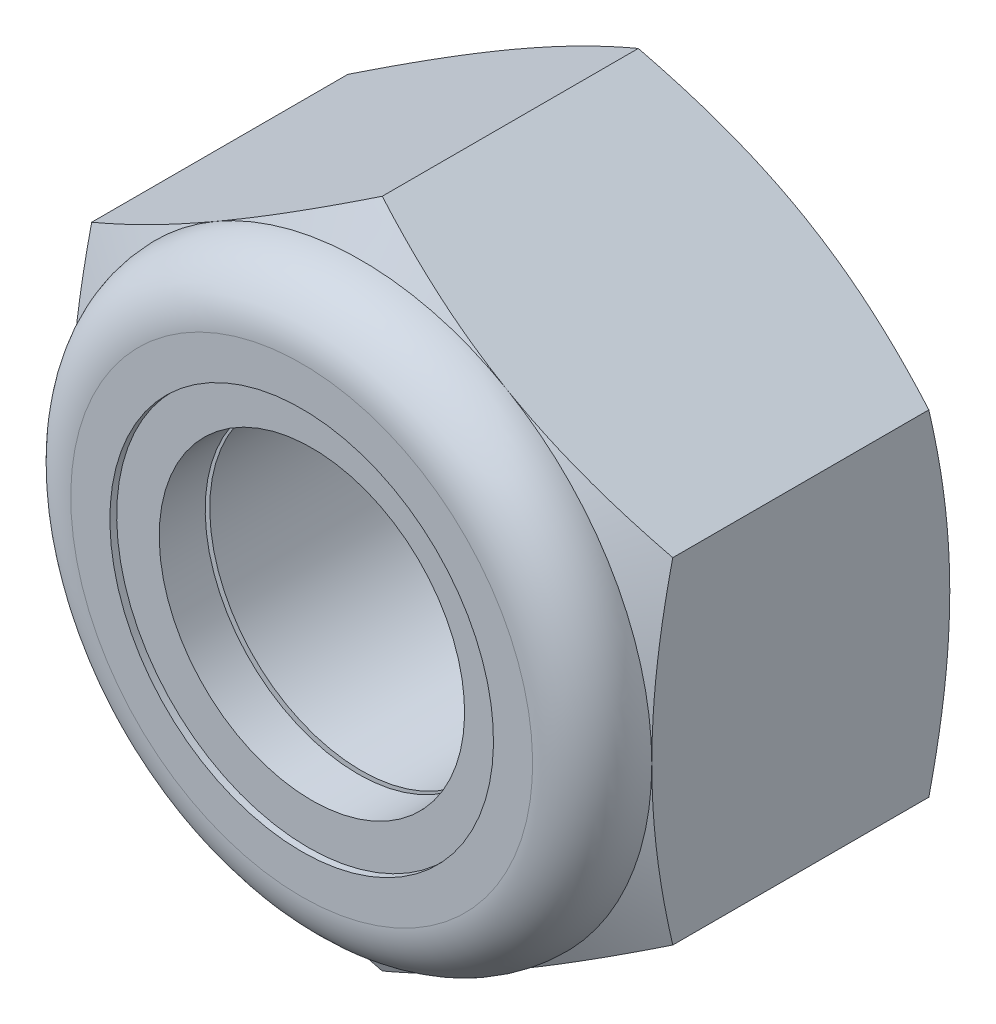
ISO-10303-21;
HEADER;
FILE_DESCRIPTION(('STEP AP214'),'2;1');
FILE_NAME('part.step','',(''),(''),'','','');
FILE_SCHEMA(('AUTOMOTIVE_DESIGN { 1 0 10303 214 1 1 1 1 }'));
ENDSEC;
DATA;
#1=APPLICATION_CONTEXT('core data for automotive mechanical design processes');
#2=APPLICATION_PROTOCOL_DEFINITION('international standard','automotive_design',2000,#1);
#3=PRODUCT_CONTEXT('',#1,'mechanical');
#4=PRODUCT('Part','Part','',(#3));
#5=PRODUCT_RELATED_PRODUCT_CATEGORY('part','',(#4));
#6=PRODUCT_DEFINITION_FORMATION('','',#4);
#7=PRODUCT_DEFINITION_CONTEXT('part definition',#1,'design');
#8=PRODUCT_DEFINITION('design','',#6,#7);
#9=PRODUCT_DEFINITION_SHAPE('','',#8);
#10=(LENGTH_UNIT() NAMED_UNIT(*) SI_UNIT(.MILLI.,.METRE.));
#11=(NAMED_UNIT(*) PLANE_ANGLE_UNIT() SI_UNIT($,.RADIAN.));
#12=(NAMED_UNIT(*) SI_UNIT($,.STERADIAN.) SOLID_ANGLE_UNIT());
#13=UNCERTAINTY_MEASURE_WITH_UNIT(LENGTH_MEASURE(1.E-05),#10,'distance_accuracy_value','');
#14=(GEOMETRIC_REPRESENTATION_CONTEXT(3) GLOBAL_UNCERTAINTY_ASSIGNED_CONTEXT((#13)) GLOBAL_UNIT_ASSIGNED_CONTEXT((#10,
#11,#12)) REPRESENTATION_CONTEXT('',''));
#15=CARTESIAN_POINT('',(0.,0.,0.));
#16=DIRECTION('',(0.,0.,1.));
#17=DIRECTION('',(1.,0.,0.));
#18=AXIS2_PLACEMENT_3D('',#15,#16,#17);
#19=CARTESIAN_POINT('',(0.,5.16666666666666,7.8476));
#20=DIRECTION('',(0.,0.,1.));
#21=DIRECTION('',(0.,-1.,0.));
#22=AXIS2_PLACEMENT_3D('',#19,#20,#21);
#23=PLANE('',#22);
#24=CARTESIAN_POINT('',(0.,0.,7.8476));
#25=DIRECTION('',(0.,0.,-1.));
#26=DIRECTION('',(0.,1.,0.));
#27=AXIS2_PLACEMENT_3D('',#24,#25,#26);
#28=CIRCLE('',#27,4.29131001134832);
#29=CARTESIAN_POINT('',(0.,-4.29131001134832,7.8476));
#30=VERTEX_POINT('',#29);
#31=EDGE_CURVE('P0_E226',#30,#30,#28,.T.);
#32=ORIENTED_EDGE('',*,*,#31,.F.);
#33=EDGE_LOOP('',(#32));
#34=FACE_BOUND('',#33,.T.);
#35=CARTESIAN_POINT('',(0.,0.,7.8476));
#36=DIRECTION('',(0.,0.,-1.));
#37=DIRECTION('',(0.,1.,0.));
#38=AXIS2_PLACEMENT_3D('',#35,#36,#37);
#39=CIRCLE('',#38,5.16666666666667);
#40=CARTESIAN_POINT('',(0.,-5.16666666666667,7.8476));
#41=VERTEX_POINT('',#40);
#42=EDGE_CURVE('P0_E204',#41,#41,#39,.T.);
#43=ORIENTED_EDGE('',*,*,#42,.T.);
#44=EDGE_LOOP('',(#43));
#45=FACE_BOUND('',#44,.T.);
#46=ADVANCED_FACE('P0_F17',(#34,#45),#23,.F.);
#47=CARTESIAN_POINT('',(0.,0.,6.66666666666667));
#48=DIRECTION('',(0.,0.,-1.));
#49=DIRECTION('',(-1.,0.,0.));
#50=AXIS2_PLACEMENT_3D('',#47,#48,#49);
#51=PLANE('',#50);
#52=CARTESIAN_POINT('',(0.,0.,6.66666666666667));
#53=DIRECTION('',(0.,0.,1.));
#54=DIRECTION('',(0.,1.,0.));
#55=AXIS2_PLACEMENT_3D('',#52,#53,#54);
#56=CIRCLE('',#55,3.38975);
#57=CARTESIAN_POINT('',(0.,-3.38975,6.66666666666667));
#58=VERTEX_POINT('',#57);
#59=EDGE_CURVE('P0_E404',#58,#58,#56,.T.);
#60=ORIENTED_EDGE('',*,*,#59,.F.);
#61=EDGE_LOOP('',(#60));
#62=FACE_BOUND('',#61,.T.);
#63=CARTESIAN_POINT('',(0.,0.,6.66666666666667));
#64=DIRECTION('',(0.,0.,-1.));
#65=DIRECTION('',(0.,1.,0.));
#66=AXIS2_PLACEMENT_3D('',#63,#64,#65);
#67=CIRCLE('',#66,6.3476);
#68=CARTESIAN_POINT('',(0.,-6.3476,6.66666666666666));
#69=VERTEX_POINT('',#68);
#70=EDGE_CURVE('P0_E123',#69,#69,#67,.T.);
#71=ORIENTED_EDGE('',*,*,#70,.F.);
#72=EDGE_LOOP('',(#71));
#73=FACE_BOUND('',#72,.T.);
#74=ADVANCED_FACE('P0_F551',(#62,#73),#51,.F.);
#75=CARTESIAN_POINT('',(6.5,3.75277674973257,8.));
#76=DIRECTION('',(-0.5,-0.866025403784439,0.));
#77=DIRECTION('',(-0.866025403784439,0.5,0.));
#78=AXIS2_PLACEMENT_3D('',#75,#76,#77);
#79=PLANE('',#78);
#80=DIRECTION('',(0.,0.,-1.));
#81=VECTOR('',#80,1.);
#82=CARTESIAN_POINT('',(0.,7.50555349946514,8.));
#83=LINE('',#82,#81);
#84=CARTESIAN_POINT('',(0.,7.50555349946514,6.19776936918152));
#85=VERTEX_POINT('',#84);
#86=CARTESIAN_POINT('',(0.,7.50555349946514,0.468897297485159));
#87=VERTEX_POINT('',#86);
#88=EDGE_CURVE('P0_E11',#85,#87,#83,.T.);
#89=ORIENTED_EDGE('',*,*,#88,.F.);
#90=CARTESIAN_POINT('',(-8.11402595225573E-12,7.50555349946982,6.19776936917933));
#91=CARTESIAN_POINT('',(1.74166975079905,6.50000000000188,6.66666666666667));
#92=CARTESIAN_POINT('',(3.25000000000002,5.62916512459884,6.66666666666667));
#93=(BOUNDED_CURVE() B_SPLINE_CURVE(2,(#90,#91,#92),.UNSPECIFIED.,.F.,
.F.) B_SPLINE_CURVE_WITH_KNOTS((3,3),(1.49446607017309,2.3298655330262),
.UNSPECIFIED.) CURVE() GEOMETRIC_REPRESENTATION_ITEM() RATIONAL_B_SPLINE_CURVE((2.10211040392093,
2.26470920953128,2.26470920953128)) REPRESENTATION_ITEM(''));
#94=CARTESIAN_POINT('',(3.25,5.62916512459885,6.66666666666667));
#95=VERTEX_POINT('',#94);
#96=EDGE_CURVE('P0_E304',#85,#95,#93,.T.);
#97=ORIENTED_EDGE('',*,*,#96,.T.);
#98=CARTESIAN_POINT('',(3.25,5.62916512459884,6.66666666666667));
#99=CARTESIAN_POINT('',(4.75833024920097,4.75833024919582,6.66666666666667));
#100=CARTESIAN_POINT('',(6.50000000000809,3.75277674972789,6.19776936917933));
#101=(BOUNDED_CURVE() B_SPLINE_CURVE(2,(#98,#99,#100),.UNSPECIFIED.,.F.,
.F.) B_SPLINE_CURVE_WITH_KNOTS((3,3),(2.32986553302619,3.16526499587929),
.UNSPECIFIED.) CURVE() GEOMETRIC_REPRESENTATION_ITEM() RATIONAL_B_SPLINE_CURVE((2.26470920953128,
2.26470920953128,2.10211040392093)) REPRESENTATION_ITEM(''));
#102=CARTESIAN_POINT('',(6.5,3.75277674973258,6.19776936918152));
#103=VERTEX_POINT('',#102);
#104=EDGE_CURVE('P0_E232',#95,#103,#101,.T.);
#105=ORIENTED_EDGE('',*,*,#104,.T.);
#106=DIRECTION('',(0.,0.,-1.));
#107=VECTOR('',#106,1.);
#108=CARTESIAN_POINT('',(6.5,3.75277674973257,8.));
#109=LINE('',#108,#107);
#110=CARTESIAN_POINT('',(6.5,3.75277674973258,0.468897297485154));
#111=VERTEX_POINT('',#110);
#112=EDGE_CURVE('P0_E162',#103,#111,#109,.T.);
#113=ORIENTED_EDGE('',*,*,#112,.T.);
#114=CARTESIAN_POINT('',(6.5000000000081,3.75277674972789,0.468897297487336));
#115=CARTESIAN_POINT('',(4.75833024920096,4.75833024919583,0.));
#116=CARTESIAN_POINT('',(3.25,5.62916512459886,0.));
#117=(BOUNDED_CURVE() B_SPLINE_CURVE(2,(#114,#115,#116),.UNSPECIFIED.,.F.,
.F.) B_SPLINE_CURVE_WITH_KNOTS((3,3),(1.49446607017308,2.32986553302618),
.UNSPECIFIED.) CURVE() GEOMETRIC_REPRESENTATION_ITEM() RATIONAL_B_SPLINE_CURVE((2.10211040392092,
2.26470920953127,2.26470920953127)) REPRESENTATION_ITEM(''));
#118=CARTESIAN_POINT('',(3.25,5.62916512459885,0.));
#119=VERTEX_POINT('',#118);
#120=EDGE_CURVE('P0_E243',#111,#119,#117,.T.);
#121=ORIENTED_EDGE('',*,*,#120,.T.);
#122=CARTESIAN_POINT('',(3.25,5.62916512459886,0.));
#123=CARTESIAN_POINT('',(1.74166975079904,6.50000000000189,0.));
#124=CARTESIAN_POINT('',(-8.11127958854562E-12,7.50555349946983,0.468897297487341));
#125=(BOUNDED_CURVE() B_SPLINE_CURVE(2,(#122,#123,#124),.UNSPECIFIED.,.F.,
.F.) B_SPLINE_CURVE_WITH_KNOTS((3,3),(2.32986553302618,3.16526499587928),
.UNSPECIFIED.) CURVE() GEOMETRIC_REPRESENTATION_ITEM() RATIONAL_B_SPLINE_CURVE((2.26470920953127,
2.26470920953127,2.10211040392092)) REPRESENTATION_ITEM(''));
#126=EDGE_CURVE('P0_E242',#119,#87,#125,.T.);
#127=ORIENTED_EDGE('',*,*,#126,.T.);
#128=EDGE_LOOP('',(#89,#97,#105,#113,#121,#127));
#129=FACE_BOUND('',#128,.T.);
#130=ADVANCED_FACE('P0_F557',(#129),#79,.F.);
#131=CARTESIAN_POINT('',(0.,7.50555349946514,8.));
#132=DIRECTION('',(0.5,-0.866025403784439,0.));
#133=DIRECTION('',(0.,0.,-1.));
#134=AXIS2_PLACEMENT_3D('',#131,#132,#133);
#135=PLANE('',#134);
#136=DIRECTION('',(0.,0.,-1.));
#137=VECTOR('',#136,1.);
#138=CARTESIAN_POINT('',(-6.5,3.75277674973257,8.));
#139=LINE('',#138,#137);
#140=CARTESIAN_POINT('',(-6.5,3.75277674973257,6.19776936918152));
#141=VERTEX_POINT('',#140);
#142=CARTESIAN_POINT('',(-6.5,3.75277674973258,0.468897297485157));
#143=VERTEX_POINT('',#142);
#144=EDGE_CURVE('P0_E30',#141,#143,#139,.T.);
#145=ORIENTED_EDGE('',*,*,#144,.F.);
#146=CARTESIAN_POINT('',(-6.50000000000811,3.75277674972789,6.19776936917933));
#147=CARTESIAN_POINT('',(-4.75833024920097,4.75833024919582,6.66666666666667));
#148=CARTESIAN_POINT('',(-3.25,5.62916512459886,6.66666666666667));
#149=(BOUNDED_CURVE() B_SPLINE_CURVE(2,(#146,#147,#148),.UNSPECIFIED.,.F.,
.F.) B_SPLINE_CURVE_WITH_KNOTS((3,3),(1.49446607017309,2.3298655330262),
.UNSPECIFIED.) CURVE() GEOMETRIC_REPRESENTATION_ITEM() RATIONAL_B_SPLINE_CURVE((2.10211040392093,
2.26470920953128,2.26470920953128)) REPRESENTATION_ITEM(''));
#150=CARTESIAN_POINT('',(-3.25,5.62916512459886,6.66666666666667));
#151=VERTEX_POINT('',#150);
#152=EDGE_CURVE('P0_E108',#141,#151,#149,.T.);
#153=ORIENTED_EDGE('',*,*,#152,.T.);
#154=CARTESIAN_POINT('',(-3.25,5.62916512459886,6.66666666666667));
#155=CARTESIAN_POINT('',(-1.74166975079904,6.50000000000188,6.66666666666667));
#156=CARTESIAN_POINT('',(8.10135042743967E-12,7.50555349946982,6.19776936917933));
#157=(BOUNDED_CURVE() B_SPLINE_CURVE(2,(#154,#155,#156),.UNSPECIFIED.,.F.,
.F.) B_SPLINE_CURVE_WITH_KNOTS((3,3),(2.3298655330262,3.16526499587929),
.UNSPECIFIED.) CURVE() GEOMETRIC_REPRESENTATION_ITEM() RATIONAL_B_SPLINE_CURVE((2.26470920953128,
2.26470920953128,2.10211040392093)) REPRESENTATION_ITEM(''));
#158=EDGE_CURVE('P0_E310',#151,#85,#157,.T.);
#159=ORIENTED_EDGE('',*,*,#158,.T.);
#160=ORIENTED_EDGE('',*,*,#88,.T.);
#161=CARTESIAN_POINT('',(8.10890292764262E-12,7.50555349946983,0.468897297487343));
#162=CARTESIAN_POINT('',(-1.74166975079904,6.50000000000189,0.));
#163=CARTESIAN_POINT('',(-3.25,5.62916512459886,0.));
#164=(BOUNDED_CURVE() B_SPLINE_CURVE(2,(#161,#162,#163),.UNSPECIFIED.,.F.,
.F.) B_SPLINE_CURVE_WITH_KNOTS((3,3),(1.49446607017308,2.32986553302618),
.UNSPECIFIED.) CURVE() GEOMETRIC_REPRESENTATION_ITEM() RATIONAL_B_SPLINE_CURVE((2.10211040392092,
2.26470920953127,2.26470920953127)) REPRESENTATION_ITEM(''));
#165=CARTESIAN_POINT('',(-3.25,5.62916512459885,0.));
#166=VERTEX_POINT('',#165);
#167=EDGE_CURVE('P0_E233',#87,#166,#164,.T.);
#168=ORIENTED_EDGE('',*,*,#167,.T.);
#169=CARTESIAN_POINT('',(-3.25,5.62916512459886,0.));
#170=CARTESIAN_POINT('',(-4.75833024920096,4.75833024919583,0.));
#171=CARTESIAN_POINT('',(-6.50000000000811,3.75277674972789,0.46889729748734));
#172=(BOUNDED_CURVE() B_SPLINE_CURVE(2,(#169,#170,#171),.UNSPECIFIED.,.F.,
.F.) B_SPLINE_CURVE_WITH_KNOTS((3,3),(2.32986553302618,3.16526499587928),
.UNSPECIFIED.) CURVE() GEOMETRIC_REPRESENTATION_ITEM() RATIONAL_B_SPLINE_CURVE((2.26470920953127,
2.26470920953127,2.10211040392092)) REPRESENTATION_ITEM(''));
#173=EDGE_CURVE('P0_E205',#166,#143,#172,.T.);
#174=ORIENTED_EDGE('',*,*,#173,.T.);
#175=EDGE_LOOP('',(#145,#153,#159,#160,#168,#174));
#176=FACE_BOUND('',#175,.T.);
#177=ADVANCED_FACE('P0_F581',(#176),#135,.F.);
#178=CARTESIAN_POINT('',(-6.5,3.75277674973257,8.));
#179=DIRECTION('',(1.,0.,0.));
#180=DIRECTION('',(0.,1.,0.));
#181=AXIS2_PLACEMENT_3D('',#178,#179,#180);
#182=PLANE('',#181);
#183=DIRECTION('',(0.,0.,-1.));
#184=VECTOR('',#183,1.);
#185=CARTESIAN_POINT('',(-6.5,-3.75277674973257,8.));
#186=LINE('',#185,#184);
#187=CARTESIAN_POINT('',(-6.5,-3.75277674973257,6.19776936918151));
#188=VERTEX_POINT('',#187);
#189=CARTESIAN_POINT('',(-6.5,-3.75277674973256,0.468897297485152));
#190=VERTEX_POINT('',#189);
#191=EDGE_CURVE('P0_E292',#188,#190,#186,.T.);
#192=ORIENTED_EDGE('',*,*,#191,.F.);
#193=CARTESIAN_POINT('',(-6.5,-3.75277674974193,6.19776936917933));
#194=CARTESIAN_POINT('',(-6.5,-1.74166975080606,6.66666666666667));
#195=CARTESIAN_POINT('',(-6.5,0.,6.66666666666667));
#196=(BOUNDED_CURVE() B_SPLINE_CURVE(2,(#193,#194,#195),.UNSPECIFIED.,.F.,
.F.) B_SPLINE_CURVE_WITH_KNOTS((3,3),(1.49446607017309,2.3298655330262),
.UNSPECIFIED.) CURVE() GEOMETRIC_REPRESENTATION_ITEM() RATIONAL_B_SPLINE_CURVE((2.10211040392093,
2.26470920953128,2.26470920953128)) REPRESENTATION_ITEM(''));
#197=CARTESIAN_POINT('',(-6.5,0.,6.66666666666667));
#198=VERTEX_POINT('',#197);
#199=EDGE_CURVE('P0_E390',#188,#198,#196,.T.);
#200=ORIENTED_EDGE('',*,*,#199,.T.);
#201=CARTESIAN_POINT('',(-6.5,0.,6.66666666666667));
#202=CARTESIAN_POINT('',(-6.5,1.74166975080607,6.66666666666667));
#203=CARTESIAN_POINT('',(-6.50000000000001,3.75277674974195,6.19776936917933));
#204=(BOUNDED_CURVE() B_SPLINE_CURVE(2,(#201,#202,#203),.UNSPECIFIED.,.F.,
.F.) B_SPLINE_CURVE_WITH_KNOTS((3,3),(2.3298655330262,3.1652649958793),
.UNSPECIFIED.) CURVE() GEOMETRIC_REPRESENTATION_ITEM() RATIONAL_B_SPLINE_CURVE((2.26470920953128,
2.26470920953128,2.10211040392093)) REPRESENTATION_ITEM(''));
#205=EDGE_CURVE('P0_E173',#198,#141,#204,.T.);
#206=ORIENTED_EDGE('',*,*,#205,.T.);
#207=ORIENTED_EDGE('',*,*,#144,.T.);
#208=CARTESIAN_POINT('',(-6.5,3.75277674974194,0.46889729748734));
#209=CARTESIAN_POINT('',(-6.5,1.74166975080607,0.));
#210=CARTESIAN_POINT('',(-6.5,0.,0.));
#211=(BOUNDED_CURVE() B_SPLINE_CURVE(2,(#208,#209,#210),.UNSPECIFIED.,.F.,
.F.) B_SPLINE_CURVE_WITH_KNOTS((3,3),(1.49446607017308,2.32986553302618),
.UNSPECIFIED.) CURVE() GEOMETRIC_REPRESENTATION_ITEM() RATIONAL_B_SPLINE_CURVE((2.10211040392092,
2.26470920953127,2.26470920953127)) REPRESENTATION_ITEM(''));
#212=CARTESIAN_POINT('',(-6.5,0.,0.));
#213=VERTEX_POINT('',#212);
#214=EDGE_CURVE('P0_E212',#143,#213,#211,.T.);
#215=ORIENTED_EDGE('',*,*,#214,.T.);
#216=CARTESIAN_POINT('',(-6.5,0.,0.));
#217=CARTESIAN_POINT('',(-6.5,-1.74166975080605,0.));
#218=CARTESIAN_POINT('',(-6.5,-3.75277674974192,0.468897297487329));
#219=(BOUNDED_CURVE() B_SPLINE_CURVE(2,(#216,#217,#218),.UNSPECIFIED.,.F.,
.F.) B_SPLINE_CURVE_WITH_KNOTS((3,3),(2.32986553302618,3.16526499587927),
.UNSPECIFIED.) CURVE() GEOMETRIC_REPRESENTATION_ITEM() RATIONAL_B_SPLINE_CURVE((2.26470920953127,
2.26470920953127,2.10211040392092)) REPRESENTATION_ITEM(''));
#220=EDGE_CURVE('P0_E345',#213,#190,#219,.T.);
#221=ORIENTED_EDGE('',*,*,#220,.T.);
#222=EDGE_LOOP('',(#192,#200,#206,#207,#215,#221));
#223=FACE_BOUND('',#222,.T.);
#224=ADVANCED_FACE('P0_F527',(#223),#182,.F.);
#225=CARTESIAN_POINT('',(-6.5,-3.75277674973257,8.));
#226=DIRECTION('',(0.5,0.866025403784439,0.));
#227=DIRECTION('',(0.,0.,-1.));
#228=AXIS2_PLACEMENT_3D('',#225,#226,#227);
#229=PLANE('',#228);
#230=DIRECTION('',(0.,0.,-1.));
#231=VECTOR('',#230,1.);
#232=CARTESIAN_POINT('',(0.,-7.50555349946514,8.));
#233=LINE('',#232,#231);
#234=CARTESIAN_POINT('',(0.,-7.50555349946515,6.19776936918151));
#235=VERTEX_POINT('',#234);
#236=CARTESIAN_POINT('',(0.,-7.50555349946514,0.46889729748515));
#237=VERTEX_POINT('',#236);
#238=EDGE_CURVE('P0_E298',#235,#237,#233,.T.);
#239=ORIENTED_EDGE('',*,*,#238,.F.);
#240=CARTESIAN_POINT('',(8.11106832979865E-12,-7.50555349946982,6.19776936917933));
#241=CARTESIAN_POINT('',(-1.74166975079904,-6.50000000000189,6.66666666666667));
#242=CARTESIAN_POINT('',(-3.25,-5.62916512459884,6.66666666666667));
#243=(BOUNDED_CURVE() B_SPLINE_CURVE(2,(#240,#241,#242),.UNSPECIFIED.,.F.,
.F.) B_SPLINE_CURVE_WITH_KNOTS((3,3),(1.49446607017309,2.32986553302619),
.UNSPECIFIED.) CURVE() GEOMETRIC_REPRESENTATION_ITEM() RATIONAL_B_SPLINE_CURVE((2.10211040392093,
2.26470920953128,2.26470920953128)) REPRESENTATION_ITEM(''));
#244=CARTESIAN_POINT('',(-3.25,-5.62916512459886,6.66666666666666));
#245=VERTEX_POINT('',#244);
#246=EDGE_CURVE('P0_E171',#235,#245,#243,.T.);
#247=ORIENTED_EDGE('',*,*,#246,.T.);
#248=CARTESIAN_POINT('',(-3.25,-5.62916512459884,6.66666666666667));
#249=CARTESIAN_POINT('',(-4.75833024920097,-4.75833024919582,6.66666666666667));
#250=CARTESIAN_POINT('',(-6.50000000000811,-3.75277674972789,6.19776936917933));
#251=(BOUNDED_CURVE() B_SPLINE_CURVE(2,(#248,#249,#250),.UNSPECIFIED.,.F.,
.F.) B_SPLINE_CURVE_WITH_KNOTS((3,3),(2.32986553302619,3.1652649958793),
.UNSPECIFIED.) CURVE() GEOMETRIC_REPRESENTATION_ITEM() RATIONAL_B_SPLINE_CURVE((2.26470920953128,
2.26470920953128,2.10211040392093)) REPRESENTATION_ITEM(''));
#252=EDGE_CURVE('P0_E21',#245,#188,#251,.T.);
#253=ORIENTED_EDGE('',*,*,#252,.T.);
#254=ORIENTED_EDGE('',*,*,#191,.T.);
#255=CARTESIAN_POINT('',(-6.50000000000813,-3.75277674972788,0.468897297487338));
#256=CARTESIAN_POINT('',(-4.75833024920097,-4.75833024919582,0.));
#257=CARTESIAN_POINT('',(-3.25,-5.62916512459884,0.));
#258=(BOUNDED_CURVE() B_SPLINE_CURVE(2,(#255,#256,#257),.UNSPECIFIED.,.F.,
.F.) B_SPLINE_CURVE_WITH_KNOTS((3,3),(1.49446607017308,2.32986553302618),
.UNSPECIFIED.) CURVE() GEOMETRIC_REPRESENTATION_ITEM() RATIONAL_B_SPLINE_CURVE((2.10211040392092,
2.26470920953127,2.26470920953127)) REPRESENTATION_ITEM(''));
#259=CARTESIAN_POINT('',(-3.25,-5.62916512459885,0.));
#260=VERTEX_POINT('',#259);
#261=EDGE_CURVE('P0_E211',#190,#260,#258,.T.);
#262=ORIENTED_EDGE('',*,*,#261,.T.);
#263=CARTESIAN_POINT('',(-3.25,-5.62916512459884,0.));
#264=CARTESIAN_POINT('',(-1.74166975079905,-6.50000000000187,0.));
#265=CARTESIAN_POINT('',(8.08856927325019E-12,-7.50555349946981,0.468897297487325));
#266=(BOUNDED_CURVE() B_SPLINE_CURVE(2,(#263,#264,#265),.UNSPECIFIED.,.F.,
.F.) B_SPLINE_CURVE_WITH_KNOTS((3,3),(2.32986553302618,3.16526499587927),
.UNSPECIFIED.) CURVE() GEOMETRIC_REPRESENTATION_ITEM() RATIONAL_B_SPLINE_CURVE((2.26470920953127,
2.26470920953127,2.10211040392092)) REPRESENTATION_ITEM(''));
#267=EDGE_CURVE('P0_E275',#260,#237,#266,.T.);
#268=ORIENTED_EDGE('',*,*,#267,.T.);
#269=EDGE_LOOP('',(#239,#247,#253,#254,#262,#268));
#270=FACE_BOUND('',#269,.T.);
#271=ADVANCED_FACE('P0_F482',(#270),#229,.F.);
#272=CARTESIAN_POINT('',(0.,-7.50555349946514,8.));
#273=DIRECTION('',(-0.5,0.866025403784439,0.));
#274=DIRECTION('',(0.,0.,1.));
#275=AXIS2_PLACEMENT_3D('',#272,#273,#274);
#276=PLANE('',#275);
#277=DIRECTION('',(0.,0.,-1.));
#278=VECTOR('',#277,1.);
#279=CARTESIAN_POINT('',(6.5,-3.75277674973257,8.));
#280=LINE('',#279,#278);
#281=CARTESIAN_POINT('',(6.5,-3.75277674973257,6.19776936918151));
#282=VERTEX_POINT('',#281);
#283=CARTESIAN_POINT('',(6.5,-3.75277674973258,0.468897297485152));
#284=VERTEX_POINT('',#283);
#285=EDGE_CURVE('P0_E44',#282,#284,#280,.T.);
#286=ORIENTED_EDGE('',*,*,#285,.F.);
#287=CARTESIAN_POINT('',(6.50000000000811,-3.75277674972789,6.19776936917933));
#288=CARTESIAN_POINT('',(4.75833024920097,-4.75833024919582,6.66666666666667));
#289=CARTESIAN_POINT('',(3.25000000000001,-5.62916512459884,6.66666666666667));
#290=(BOUNDED_CURVE() B_SPLINE_CURVE(2,(#287,#288,#289),.UNSPECIFIED.,.F.,
.F.) B_SPLINE_CURVE_WITH_KNOTS((3,3),(1.49446607017309,2.32986553302619),
.UNSPECIFIED.) CURVE() GEOMETRIC_REPRESENTATION_ITEM() RATIONAL_B_SPLINE_CURVE((2.10211040392093,
2.26470920953128,2.26470920953128)) REPRESENTATION_ITEM(''));
#291=CARTESIAN_POINT('',(3.25,-5.62916512459886,6.66666666666666));
#292=VERTEX_POINT('',#291);
#293=EDGE_CURVE('P0_E154',#282,#292,#290,.T.);
#294=ORIENTED_EDGE('',*,*,#293,.T.);
#295=CARTESIAN_POINT('',(3.25000000000001,-5.62916512459884,6.66666666666667));
#296=CARTESIAN_POINT('',(1.74166975079903,-6.50000000000188,6.66666666666666));
#297=CARTESIAN_POINT('',(-8.1309266520105E-12,-7.50555349946984,6.19776936917933));
#298=(BOUNDED_CURVE() B_SPLINE_CURVE(2,(#295,#296,#297),.UNSPECIFIED.,.F.,
.F.) B_SPLINE_CURVE_WITH_KNOTS((3,3),(2.32986553302619,3.1652649958793),
.UNSPECIFIED.) CURVE() GEOMETRIC_REPRESENTATION_ITEM() RATIONAL_B_SPLINE_CURVE((2.26470920953128,
2.26470920953129,2.10211040392093)) REPRESENTATION_ITEM(''));
#299=EDGE_CURVE('P0_E157',#292,#235,#298,.T.);
#300=ORIENTED_EDGE('',*,*,#299,.T.);
#301=ORIENTED_EDGE('',*,*,#238,.T.);
#302=CARTESIAN_POINT('',(-8.12765214143305E-12,-7.50555349946983,0.468897297487335));
#303=CARTESIAN_POINT('',(1.74166975079903,-6.50000000000189,0.));
#304=CARTESIAN_POINT('',(3.25,-5.62916512459884,0.));
#305=(BOUNDED_CURVE() B_SPLINE_CURVE(2,(#302,#303,#304),.UNSPECIFIED.,.F.,
.F.) B_SPLINE_CURVE_WITH_KNOTS((3,3),(1.49446607017308,2.32986553302618),
.UNSPECIFIED.) CURVE() GEOMETRIC_REPRESENTATION_ITEM() RATIONAL_B_SPLINE_CURVE((2.10211040392092,
2.26470920953127,2.26470920953127)) REPRESENTATION_ITEM(''));
#306=CARTESIAN_POINT('',(3.25,-5.62916512459886,0.));
#307=VERTEX_POINT('',#306);
#308=EDGE_CURVE('P0_E354',#237,#307,#305,.T.);
#309=ORIENTED_EDGE('',*,*,#308,.T.);
#310=CARTESIAN_POINT('',(3.25,-5.62916512459884,0.));
#311=CARTESIAN_POINT('',(4.75833024920096,-4.75833024919582,0.));
#312=CARTESIAN_POINT('',(6.50000000000812,-3.75277674972788,0.468897297487336));
#313=(BOUNDED_CURVE() B_SPLINE_CURVE(2,(#310,#311,#312),.UNSPECIFIED.,.F.,
.F.) B_SPLINE_CURVE_WITH_KNOTS((3,3),(2.32986553302618,3.16526499587928),
.UNSPECIFIED.) CURVE() GEOMETRIC_REPRESENTATION_ITEM() RATIONAL_B_SPLINE_CURVE((2.26470920953127,
2.26470920953127,2.10211040392092)) REPRESENTATION_ITEM(''));
#314=EDGE_CURVE('P0_E274',#307,#284,#313,.T.);
#315=ORIENTED_EDGE('',*,*,#314,.T.);
#316=EDGE_LOOP('',(#286,#294,#300,#301,#309,#315));
#317=FACE_BOUND('',#316,.T.);
#318=ADVANCED_FACE('P0_F156',(#317),#276,.F.);
#319=CARTESIAN_POINT('',(6.5,-3.75277674973257,8.));
#320=DIRECTION('',(-1.,0.,0.));
#321=DIRECTION('',(0.,1.,0.));
#322=AXIS2_PLACEMENT_3D('',#319,#320,#321);
#323=PLANE('',#322);
#324=ORIENTED_EDGE('',*,*,#112,.F.);
#325=CARTESIAN_POINT('',(6.49999999999999,3.75277674974196,6.19776936917933));
#326=CARTESIAN_POINT('',(6.50000000000001,1.74166975080607,6.66666666666666));
#327=CARTESIAN_POINT('',(6.5,0.,6.66666666666667));
#328=(BOUNDED_CURVE() B_SPLINE_CURVE(2,(#325,#326,#327),.UNSPECIFIED.,.F.,
.F.) B_SPLINE_CURVE_WITH_KNOTS((3,3),(1.49446607017309,2.32986553302619),
.UNSPECIFIED.) CURVE() GEOMETRIC_REPRESENTATION_ITEM() RATIONAL_B_SPLINE_CURVE((2.10211040392093,
2.26470920953129,2.26470920953128)) REPRESENTATION_ITEM(''));
#329=CARTESIAN_POINT('',(6.5,0.,6.66666666666667));
#330=VERTEX_POINT('',#329);
#331=EDGE_CURVE('P0_E264',#103,#330,#328,.T.);
#332=ORIENTED_EDGE('',*,*,#331,.T.);
#333=CARTESIAN_POINT('',(6.5,0.,6.66666666666667));
#334=CARTESIAN_POINT('',(6.5,-1.74166975080607,6.66666666666667));
#335=CARTESIAN_POINT('',(6.5,-3.75277674974194,6.19776936917933));
#336=(BOUNDED_CURVE() B_SPLINE_CURVE(2,(#333,#334,#335),.UNSPECIFIED.,.F.,
.F.) B_SPLINE_CURVE_WITH_KNOTS((3,3),(2.32986553302619,3.1652649958793),
.UNSPECIFIED.) CURVE() GEOMETRIC_REPRESENTATION_ITEM() RATIONAL_B_SPLINE_CURVE((2.26470920953128,
2.26470920953128,2.10211040392093)) REPRESENTATION_ITEM(''));
#337=EDGE_CURVE('P0_E163',#330,#282,#336,.T.);
#338=ORIENTED_EDGE('',*,*,#337,.T.);
#339=ORIENTED_EDGE('',*,*,#285,.T.);
#340=CARTESIAN_POINT('',(6.5,-3.75277674974195,0.468897297487337));
#341=CARTESIAN_POINT('',(6.5,-1.74166975080606,0.));
#342=CARTESIAN_POINT('',(6.5,0.,0.));
#343=(BOUNDED_CURVE() B_SPLINE_CURVE(2,(#340,#341,#342),.UNSPECIFIED.,.F.,
.F.) B_SPLINE_CURVE_WITH_KNOTS((3,3),(1.49446607017307,2.32986553302618),
.UNSPECIFIED.) CURVE() GEOMETRIC_REPRESENTATION_ITEM() RATIONAL_B_SPLINE_CURVE((2.10211040392092,
2.26470920953127,2.26470920953127)) REPRESENTATION_ITEM(''));
#344=CARTESIAN_POINT('',(6.5,0.,0.));
#345=VERTEX_POINT('',#344);
#346=EDGE_CURVE('P0_E265',#284,#345,#343,.T.);
#347=ORIENTED_EDGE('',*,*,#346,.T.);
#348=CARTESIAN_POINT('',(6.5,0.,0.));
#349=CARTESIAN_POINT('',(6.5,1.74166975080607,0.));
#350=CARTESIAN_POINT('',(6.5,3.75277674974193,0.468897297487336));
#351=(BOUNDED_CURVE() B_SPLINE_CURVE(2,(#348,#349,#350),.UNSPECIFIED.,.F.,
.F.) B_SPLINE_CURVE_WITH_KNOTS((3,3),(2.32986553302618,3.16526499587928),
.UNSPECIFIED.) CURVE() GEOMETRIC_REPRESENTATION_ITEM() RATIONAL_B_SPLINE_CURVE((2.26470920953127,
2.26470920953127,2.10211040392092)) REPRESENTATION_ITEM(''));
#352=EDGE_CURVE('P0_E330',#345,#111,#351,.T.);
#353=ORIENTED_EDGE('',*,*,#352,.T.);
#354=EDGE_LOOP('',(#324,#332,#338,#339,#347,#353));
#355=FACE_BOUND('',#354,.T.);
#356=ADVANCED_FACE('P0_F697',(#355),#323,.F.);
#357=CARTESIAN_POINT('',(0.,0.,6.66666666666667));
#358=DIRECTION('',(0.,0.,-1.));
#359=DIRECTION('',(0.,1.,0.));
#360=AXIS2_PLACEMENT_3D('',#357,#358,#359);
#361=CONICAL_SURFACE('',#360,6.5,1.13446401379632);
#362=ORIENTED_EDGE('',*,*,#337,.F.);
#363=CARTESIAN_POINT('',(0.,0.,6.66666666666667));
#364=DIRECTION('',(0.,0.,-1.));
#365=DIRECTION('',(0.,1.,0.));
#366=AXIS2_PLACEMENT_3D('',#363,#364,#365);
#367=CIRCLE('',#366,6.5);
#368=EDGE_CURVE('P0_E176',#330,#292,#367,.T.);
#369=ORIENTED_EDGE('',*,*,#368,.T.);
#370=ORIENTED_EDGE('',*,*,#293,.F.);
#371=EDGE_LOOP('',(#362,#369,#370));
#372=FACE_BOUND('',#371,.T.);
#373=ADVANCED_FACE('P0_F177',(#372),#361,.T.);
#374=CARTESIAN_POINT('',(0.,0.,6.66666666666667));
#375=DIRECTION('',(0.,0.,-1.));
#376=DIRECTION('',(0.,1.,0.));
#377=AXIS2_PLACEMENT_3D('',#374,#375,#376);
#378=CONICAL_SURFACE('',#377,6.5,1.13446401379632);
#379=CARTESIAN_POINT('',(0.,0.,6.66666666666667));
#380=DIRECTION('',(0.,0.,-1.));
#381=DIRECTION('',(0.,1.,0.));
#382=AXIS2_PLACEMENT_3D('',#379,#380,#381);
#383=CIRCLE('',#382,6.5);
#384=EDGE_CURVE('P0_E182',#95,#330,#383,.T.);
#385=ORIENTED_EDGE('',*,*,#384,.T.);
#386=ORIENTED_EDGE('',*,*,#331,.F.);
#387=ORIENTED_EDGE('',*,*,#104,.F.);
#388=EDGE_LOOP('',(#385,#386,#387));
#389=FACE_BOUND('',#388,.T.);
#390=ADVANCED_FACE('P0_F449',(#389),#378,.T.);
#391=CARTESIAN_POINT('',(0.,0.,6.66666666666667));
#392=DIRECTION('',(0.,0.,-1.));
#393=DIRECTION('',(0.,-1.,0.));
#394=AXIS2_PLACEMENT_3D('',#391,#392,#393);
#395=CONICAL_SURFACE('',#394,6.5,1.13446401379632);
#396=ORIENTED_EDGE('',*,*,#299,.F.);
#397=CARTESIAN_POINT('',(0.,0.,6.66666666666667));
#398=DIRECTION('',(0.,0.,-1.));
#399=DIRECTION('',(0.,1.,0.));
#400=AXIS2_PLACEMENT_3D('',#397,#398,#399);
#401=CIRCLE('',#400,6.5);
#402=CARTESIAN_POINT('',(0.,-6.5,6.66666666666666));
#403=VERTEX_POINT('',#402);
#404=EDGE_CURVE('P0_E169',#292,#403,#401,.T.);
#405=ORIENTED_EDGE('',*,*,#404,.T.);
#406=CARTESIAN_POINT('',(0.,0.,6.66666666666667));
#407=DIRECTION('',(0.,0.,-1.));
#408=DIRECTION('',(0.,1.,0.));
#409=AXIS2_PLACEMENT_3D('',#406,#407,#408);
#410=CIRCLE('',#409,6.5);
#411=EDGE_CURVE('P0_E220',#403,#245,#410,.T.);
#412=ORIENTED_EDGE('',*,*,#411,.T.);
#413=ORIENTED_EDGE('',*,*,#246,.F.);
#414=EDGE_LOOP('',(#396,#405,#412,#413));
#415=FACE_BOUND('',#414,.T.);
#416=ADVANCED_FACE('P0_F19',(#415),#395,.T.);
#417=CARTESIAN_POINT('',(0.,0.,6.66666666666667));
#418=DIRECTION('',(0.,0.,-1.));
#419=DIRECTION('',(0.,1.,0.));
#420=AXIS2_PLACEMENT_3D('',#417,#418,#419);
#421=CONICAL_SURFACE('',#420,6.5,1.13446401379632);
#422=CARTESIAN_POINT('',(0.,0.,6.66666666666667));
#423=DIRECTION('',(0.,0.,-1.));
#424=DIRECTION('',(0.,1.,0.));
#425=AXIS2_PLACEMENT_3D('',#422,#423,#424);
#426=CIRCLE('',#425,6.5);
#427=EDGE_CURVE('P0_E221',#198,#151,#426,.T.);
#428=ORIENTED_EDGE('',*,*,#427,.T.);
#429=ORIENTED_EDGE('',*,*,#152,.F.);
#430=ORIENTED_EDGE('',*,*,#205,.F.);
#431=EDGE_LOOP('',(#428,#429,#430));
#432=FACE_BOUND('',#431,.T.);
#433=ADVANCED_FACE('P0_F458',(#432),#421,.T.);
#434=CARTESIAN_POINT('',(0.,0.,6.66666666666667));
#435=DIRECTION('',(0.,0.,-1.));
#436=DIRECTION('',(0.,1.,0.));
#437=AXIS2_PLACEMENT_3D('',#434,#435,#436);
#438=CONICAL_SURFACE('',#437,6.5,1.13446401379632);
#439=ORIENTED_EDGE('',*,*,#252,.F.);
#440=CARTESIAN_POINT('',(0.,0.,6.66666666666667));
#441=DIRECTION('',(0.,0.,-1.));
#442=DIRECTION('',(0.,1.,0.));
#443=AXIS2_PLACEMENT_3D('',#440,#441,#442);
#444=CIRCLE('',#443,6.5);
#445=EDGE_CURVE('P0_E213',#245,#198,#444,.T.);
#446=ORIENTED_EDGE('',*,*,#445,.T.);
#447=ORIENTED_EDGE('',*,*,#199,.F.);
#448=EDGE_LOOP('',(#439,#446,#447));
#449=FACE_BOUND('',#448,.T.);
#450=ADVANCED_FACE('P0_F530',(#449),#438,.T.);
#451=CARTESIAN_POINT('',(0.,0.,0.468897297485155));
#452=DIRECTION('',(0.,0.,1.));
#453=DIRECTION('',(0.,-1.,0.));
#454=AXIS2_PLACEMENT_3D('',#451,#452,#453);
#455=CONICAL_SURFACE('',#454,7.50555349946514,1.13446401379631);
#456=CARTESIAN_POINT('',(0.,0.,0.));
#457=DIRECTION('',(0.,0.,-1.));
#458=DIRECTION('',(0.,1.,0.));
#459=AXIS2_PLACEMENT_3D('',#456,#457,#458);
#460=CIRCLE('',#459,6.5);
#461=EDGE_CURVE('P0_E338',#260,#213,#460,.T.);
#462=ORIENTED_EDGE('',*,*,#461,.F.);
#463=ORIENTED_EDGE('',*,*,#261,.F.);
#464=ORIENTED_EDGE('',*,*,#220,.F.);
#465=EDGE_LOOP('',(#462,#463,#464));
#466=FACE_BOUND('',#465,.T.);
#467=ADVANCED_FACE('P0_F564',(#466),#455,.T.);
#468=CARTESIAN_POINT('',(0.,0.,0.468897297485155));
#469=DIRECTION('',(0.,0.,1.));
#470=DIRECTION('',(0.,-1.,0.));
#471=AXIS2_PLACEMENT_3D('',#468,#469,#470);
#472=CONICAL_SURFACE('',#471,7.50555349946514,1.13446401379631);
#473=CARTESIAN_POINT('',(0.,0.,0.));
#474=DIRECTION('',(0.,0.,-1.));
#475=DIRECTION('',(0.,1.,0.));
#476=AXIS2_PLACEMENT_3D('',#473,#474,#475);
#477=CIRCLE('',#476,6.5);
#478=EDGE_CURVE('P0_E331',#213,#166,#477,.T.);
#479=ORIENTED_EDGE('',*,*,#478,.F.);
#480=ORIENTED_EDGE('',*,*,#214,.F.);
#481=ORIENTED_EDGE('',*,*,#173,.F.);
#482=EDGE_LOOP('',(#479,#480,#481));
#483=FACE_BOUND('',#482,.T.);
#484=ADVANCED_FACE('P0_F566',(#483),#472,.T.);
#485=CARTESIAN_POINT('',(0.,0.,0.468897297485155));
#486=DIRECTION('',(0.,0.,1.));
#487=DIRECTION('',(0.,1.,0.));
#488=AXIS2_PLACEMENT_3D('',#485,#486,#487);
#489=CONICAL_SURFACE('',#488,7.50555349946514,1.13446401379631);
#490=CARTESIAN_POINT('',(0.,0.,0.));
#491=DIRECTION('',(0.,0.,-1.));
#492=DIRECTION('',(0.,1.,0.));
#493=AXIS2_PLACEMENT_3D('',#490,#491,#492);
#494=CIRCLE('',#493,6.5);
#495=EDGE_CURVE('P0_E199',#166,#119,#494,.T.);
#496=ORIENTED_EDGE('',*,*,#495,.F.);
#497=ORIENTED_EDGE('',*,*,#167,.F.);
#498=ORIENTED_EDGE('',*,*,#126,.F.);
#499=EDGE_LOOP('',(#496,#497,#498));
#500=FACE_BOUND('',#499,.T.);
#501=ADVANCED_FACE('P0_F572',(#500),#489,.T.);
#502=CARTESIAN_POINT('',(0.,0.,0.468897297485155));
#503=DIRECTION('',(0.,0.,1.));
#504=DIRECTION('',(0.,-1.,0.));
#505=AXIS2_PLACEMENT_3D('',#502,#503,#504);
#506=CONICAL_SURFACE('',#505,7.50555349946514,1.13446401379631);
#507=ORIENTED_EDGE('',*,*,#352,.F.);
#508=CARTESIAN_POINT('',(0.,0.,0.));
#509=DIRECTION('',(0.,0.,-1.));
#510=DIRECTION('',(0.,1.,0.));
#511=AXIS2_PLACEMENT_3D('',#508,#509,#510);
#512=CIRCLE('',#511,6.5);
#513=EDGE_CURVE('P0_E244',#119,#345,#512,.T.);
#514=ORIENTED_EDGE('',*,*,#513,.F.);
#515=ORIENTED_EDGE('',*,*,#120,.F.);
#516=EDGE_LOOP('',(#507,#514,#515));
#517=FACE_BOUND('',#516,.T.);
#518=ADVANCED_FACE('P0_F545',(#517),#506,.T.);
#519=CARTESIAN_POINT('',(0.,0.,0.468897297485155));
#520=DIRECTION('',(0.,0.,1.));
#521=DIRECTION('',(0.,-1.,0.));
#522=AXIS2_PLACEMENT_3D('',#519,#520,#521);
#523=CONICAL_SURFACE('',#522,7.50555349946514,1.13446401379631);
#524=CARTESIAN_POINT('',(0.,0.,0.));
#525=DIRECTION('',(0.,0.,-1.));
#526=DIRECTION('',(0.,1.,0.));
#527=AXIS2_PLACEMENT_3D('',#524,#525,#526);
#528=CIRCLE('',#527,6.5);
#529=EDGE_CURVE('P0_E251',#345,#307,#528,.T.);
#530=ORIENTED_EDGE('',*,*,#529,.F.);
#531=ORIENTED_EDGE('',*,*,#346,.F.);
#532=ORIENTED_EDGE('',*,*,#314,.F.);
#533=EDGE_LOOP('',(#530,#531,#532));
#534=FACE_BOUND('',#533,.T.);
#535=ADVANCED_FACE('P0_F536',(#534),#523,.T.);
#536=CARTESIAN_POINT('',(-6.5,11.2583302491977,8.));
#537=DIRECTION('',(0.,0.,1.));
#538=DIRECTION('',(0.,-1.,0.));
#539=AXIS2_PLACEMENT_3D('',#536,#537,#538);
#540=PLANE('',#539);
#541=CARTESIAN_POINT('',(0.,0.,8.));
#542=DIRECTION('',(0.,0.,1.));
#543=DIRECTION('',(0.,-1.,0.));
#544=AXIS2_PLACEMENT_3D('',#541,#542,#543);
#545=CIRCLE('',#544,4.29131001134832);
#546=CARTESIAN_POINT('',(0.,-4.29131001134832,8.));
#547=VERTEX_POINT('',#546);
#548=EDGE_CURVE('P0_E227',#547,#547,#545,.T.);
#549=ORIENTED_EDGE('',*,*,#548,.F.);
#550=EDGE_LOOP('',(#549));
#551=FACE_BOUND('',#550,.T.);
#552=CARTESIAN_POINT('',(0.,0.,8.));
#553=DIRECTION('',(0.,0.,-1.));
#554=DIRECTION('',(0.,1.,0.));
#555=AXIS2_PLACEMENT_3D('',#552,#553,#554);
#556=CIRCLE('',#555,5.16666666666667);
#557=CARTESIAN_POINT('',(0.,-5.16666666666667,8.));
#558=VERTEX_POINT('',#557);
#559=EDGE_CURVE('P0_E190',#558,#558,#556,.T.);
#560=ORIENTED_EDGE('',*,*,#559,.F.);
#561=EDGE_LOOP('',(#560));
#562=FACE_BOUND('',#561,.T.);
#563=ADVANCED_FACE('P0_F534',(#551,#562),#540,.T.);
#564=CARTESIAN_POINT('',(0.,0.,0.468897297485155));
#565=DIRECTION('',(0.,0.,1.));
#566=DIRECTION('',(0.,-1.,0.));
#567=AXIS2_PLACEMENT_3D('',#564,#565,#566);
#568=CONICAL_SURFACE('',#567,7.50555349946514,1.13446401379631);
#569=CARTESIAN_POINT('',(0.,0.,0.));
#570=DIRECTION('',(0.,0.,-1.));
#571=DIRECTION('',(0.,1.,0.));
#572=AXIS2_PLACEMENT_3D('',#569,#570,#571);
#573=CIRCLE('',#572,6.5);
#574=EDGE_CURVE('P0_E377',#307,#260,#573,.T.);
#575=ORIENTED_EDGE('',*,*,#574,.F.);
#576=ORIENTED_EDGE('',*,*,#308,.F.);
#577=ORIENTED_EDGE('',*,*,#267,.F.);
#578=EDGE_LOOP('',(#575,#576,#577));
#579=FACE_BOUND('',#578,.T.);
#580=ADVANCED_FACE('P0_F500',(#579),#568,.T.);
#581=CARTESIAN_POINT('',(0.,0.,6.66666666666667));
#582=DIRECTION('',(0.,0.,-1.));
#583=DIRECTION('',(0.,1.,0.));
#584=AXIS2_PLACEMENT_3D('',#581,#582,#583);
#585=CONICAL_SURFACE('',#584,6.5,1.13446401379632);
#586=CARTESIAN_POINT('',(0.,0.,6.66666666666667));
#587=DIRECTION('',(0.,0.,-1.));
#588=DIRECTION('',(0.,1.,0.));
#589=AXIS2_PLACEMENT_3D('',#586,#587,#588);
#590=CIRCLE('',#589,6.5);
#591=EDGE_CURVE('P0_E257',#151,#95,#590,.T.);
#592=ORIENTED_EDGE('',*,*,#591,.T.);
#593=ORIENTED_EDGE('',*,*,#96,.F.);
#594=ORIENTED_EDGE('',*,*,#158,.F.);
#595=EDGE_LOOP('',(#592,#593,#594));
#596=FACE_BOUND('',#595,.T.);
#597=ADVANCED_FACE('P0_F453',(#596),#585,.T.);
#598=CARTESIAN_POINT('',(0.,0.,6.66666666666667));
#599=DIRECTION('',(0.,0.,-1.));
#600=DIRECTION('',(0.,1.,0.));
#601=AXIS2_PLACEMENT_3D('',#598,#599,#600);
#602=TOROIDAL_SURFACE('',#601,5.16666666666667,1.33333333333333);
#603=ORIENTED_EDGE('',*,*,#591,.F.);
#604=ORIENTED_EDGE('',*,*,#427,.F.);
#605=ORIENTED_EDGE('',*,*,#445,.F.);
#606=ORIENTED_EDGE('',*,*,#411,.F.);
#607=CARTESIAN_POINT('',(0.,-5.16666666666667,6.66666666666667));
#608=DIRECTION('',(-1.,0.,0.));
#609=DIRECTION('',(0.,-1.,0.));
#610=AXIS2_PLACEMENT_3D('',#607,#608,#609);
#611=CIRCLE('',#610,1.33333333333333);
#612=EDGE_CURVE('P0_E187',#403,#558,#611,.T.);
#613=ORIENTED_EDGE('',*,*,#612,.T.);
#614=ORIENTED_EDGE('',*,*,#559,.T.);
#615=ORIENTED_EDGE('',*,*,#612,.F.);
#616=ORIENTED_EDGE('',*,*,#404,.F.);
#617=ORIENTED_EDGE('',*,*,#368,.F.);
#618=ORIENTED_EDGE('',*,*,#384,.F.);
#619=EDGE_LOOP('',(#603,#604,#605,#606,#613,#614,#615,#616,#617,#618));
#620=FACE_BOUND('',#619,.T.);
#621=ADVANCED_FACE('P0_F185',(#620),#602,.T.);
#622=CARTESIAN_POINT('',(0.,0.,6.66666666666667));
#623=DIRECTION('',(0.,0.,-1.));
#624=DIRECTION('',(0.,1.,0.));
#625=AXIS2_PLACEMENT_3D('',#622,#623,#624);
#626=TOROIDAL_SURFACE('',#625,5.16666666666667,1.18093333333333);
#627=ORIENTED_EDGE('',*,*,#42,.F.);
#628=CARTESIAN_POINT('',(0.,-5.16666666666667,6.66666666666667));
#629=DIRECTION('',(1.,0.,0.));
#630=DIRECTION('',(0.,-1.,0.));
#631=AXIS2_PLACEMENT_3D('',#628,#629,#630);
#632=CIRCLE('',#631,1.18093333333333);
#633=EDGE_CURVE('P0_E201',#41,#69,#632,.T.);
#634=ORIENTED_EDGE('',*,*,#633,.T.);
#635=ORIENTED_EDGE('',*,*,#70,.T.);
#636=ORIENTED_EDGE('',*,*,#633,.F.);
#637=EDGE_LOOP('',(#627,#634,#635,#636));
#638=FACE_BOUND('',#637,.T.);
#639=ADVANCED_FACE('P0_F677',(#638),#626,.F.);
#640=CARTESIAN_POINT('',(0.,0.,9.27));
#641=DIRECTION('',(0.,0.,-1.));
#642=DIRECTION('',(0.,1.,0.));
#643=AXIS2_PLACEMENT_3D('',#640,#641,#642);
#644=CYLINDRICAL_SURFACE('',#643,4.29131001134832);
#645=ORIENTED_EDGE('',*,*,#548,.T.);
#646=DIRECTION('',(0.,0.,-1.));
#647=VECTOR('',#646,1.);
#648=CARTESIAN_POINT('',(0.,-4.29131001134832,9.27));
#649=LINE('',#648,#647);
#650=EDGE_CURVE('P0_E222',#547,#30,#649,.T.);
#651=ORIENTED_EDGE('',*,*,#650,.T.);
#652=ORIENTED_EDGE('',*,*,#31,.T.);
#653=ORIENTED_EDGE('',*,*,#650,.F.);
#654=EDGE_LOOP('',(#645,#651,#652,#653));
#655=FACE_BOUND('',#654,.T.);
#656=ADVANCED_FACE('P0_F682',(#655),#644,.F.);
#657=CARTESIAN_POINT('',(0.,0.,-4.));
#658=DIRECTION('',(0.,0.,-1.));
#659=DIRECTION('',(0.,1.,0.));
#660=AXIS2_PLACEMENT_3D('',#657,#658,#659);
#661=CYLINDRICAL_SURFACE('',#660,3.38975);
#662=ORIENTED_EDGE('',*,*,#59,.T.);
#663=DIRECTION('',(0.,0.,-1.));
#664=VECTOR('',#663,1.);
#665=CARTESIAN_POINT('',(0.,-3.38975,-4.));
#666=LINE('',#665,#664);
#667=CARTESIAN_POINT('',(0.,-3.38975,0.));
#668=VERTEX_POINT('',#667);
#669=EDGE_CURVE('P0_E286',#58,#668,#666,.T.);
#670=ORIENTED_EDGE('',*,*,#669,.T.);
#671=CARTESIAN_POINT('',(0.,0.,0.));
#672=DIRECTION('',(0.,0.,-1.));
#673=DIRECTION('',(0.,1.,0.));
#674=AXIS2_PLACEMENT_3D('',#671,#672,#673);
#675=CIRCLE('',#674,3.38975);
#676=EDGE_CURVE('P0_E282',#668,#668,#675,.T.);
#677=ORIENTED_EDGE('',*,*,#676,.T.);
#678=ORIENTED_EDGE('',*,*,#669,.F.);
#679=EDGE_LOOP('',(#662,#670,#677,#678));
#680=FACE_BOUND('',#679,.T.);
#681=ADVANCED_FACE('P0_F671',(#680),#661,.F.);
#682=CARTESIAN_POINT('',(-6.5,11.2583302491977,0.));
#683=DIRECTION('',(0.,0.,1.));
#684=DIRECTION('',(0.,-1.,0.));
#685=AXIS2_PLACEMENT_3D('',#682,#683,#684);
#686=PLANE('',#685);
#687=ORIENTED_EDGE('',*,*,#676,.F.);
#688=EDGE_LOOP('',(#687));
#689=FACE_BOUND('',#688,.T.);
#690=ORIENTED_EDGE('',*,*,#574,.T.);
#691=ORIENTED_EDGE('',*,*,#461,.T.);
#692=ORIENTED_EDGE('',*,*,#478,.T.);
#693=ORIENTED_EDGE('',*,*,#495,.T.);
#694=ORIENTED_EDGE('',*,*,#513,.T.);
#695=ORIENTED_EDGE('',*,*,#529,.T.);
#696=EDGE_LOOP('',(#690,#691,#692,#693,#694,#695));
#697=FACE_BOUND('',#696,.T.);
#698=ADVANCED_FACE('P0_F496',(#689,#697),#686,.F.);
#699=CLOSED_SHELL('',(#46,#74,#130,#177,#224,#271,#318,#356,#373,#390,#416,#433,#450,#467,#484,
#501,#518,#535,#563,#580,#597,#621,#639,#656,#681,#698));
#700=MANIFOLD_SOLID_BREP('P0_B1',#699);
#701=CARTESIAN_POINT('',(0.,5.16666666666666,7.7714));
#702=DIRECTION('',(0.,0.,1.));
#703=DIRECTION('',(0.,-1.,0.));
#704=AXIS2_PLACEMENT_3D('',#701,#702,#703);
#705=PLANE('',#704);
#706=CARTESIAN_POINT('',(0.,0.,7.7714));
#707=DIRECTION('',(0.,0.,-1.));
#708=DIRECTION('',(0.,1.,0.));
#709=AXIS2_PLACEMENT_3D('',#706,#707,#708);
#710=CIRCLE('',#709,3.41595335602996);
#711=CARTESIAN_POINT('',(0.,-3.41595335602997,7.7714));
#712=VERTEX_POINT('',#711);
#713=EDGE_CURVE('P1_E59',#712,#712,#710,.T.);
#714=ORIENTED_EDGE('',*,*,#713,.T.);
#715=EDGE_LOOP('',(#714));
#716=FACE_BOUND('',#715,.T.);
#717=CARTESIAN_POINT('',(0.,0.,7.7714));
#718=DIRECTION('',(0.,0.,-1.));
#719=DIRECTION('',(0.,1.,0.));
#720=AXIS2_PLACEMENT_3D('',#717,#718,#719);
#721=CIRCLE('',#720,5.16666666666667);
#722=CARTESIAN_POINT('',(0.,-5.16666666666667,7.7714));
#723=VERTEX_POINT('',#722);
#724=EDGE_CURVE('P1_E55',#723,#723,#721,.T.);
#725=ORIENTED_EDGE('',*,*,#724,.F.);
#726=EDGE_LOOP('',(#725));
#727=FACE_BOUND('',#726,.T.);
#728=ADVANCED_FACE('P1_F17',(#716,#727),#705,.T.);
#729=CARTESIAN_POINT('',(0.,3.41595335602996,6.74286666666667));
#730=DIRECTION('',(0.,0.,-1.));
#731=DIRECTION('',(-1.,0.,0.));
#732=AXIS2_PLACEMENT_3D('',#729,#730,#731);
#733=PLANE('',#732);
#734=CARTESIAN_POINT('',(0.,0.,6.74286666666667));
#735=DIRECTION('',(0.,0.,-1.));
#736=DIRECTION('',(0.,1.,0.));
#737=AXIS2_PLACEMENT_3D('',#734,#735,#736);
#738=CIRCLE('',#737,3.41595335602996);
#739=CARTESIAN_POINT('',(0.,-3.41595335602997,6.74286666666667));
#740=VERTEX_POINT('',#739);
#741=EDGE_CURVE('P1_E11',#740,#740,#738,.T.);
#742=ORIENTED_EDGE('',*,*,#741,.F.);
#743=EDGE_LOOP('',(#742));
#744=FACE_BOUND('',#743,.T.);
#745=CARTESIAN_POINT('',(0.,0.,6.74286666666667));
#746=DIRECTION('',(0.,0.,-1.));
#747=DIRECTION('',(0.,1.,0.));
#748=AXIS2_PLACEMENT_3D('',#745,#746,#747);
#749=CIRCLE('',#748,6.26876888414823);
#750=CARTESIAN_POINT('',(0.,-6.26876888414823,6.74286666666667));
#751=VERTEX_POINT('',#750);
#752=EDGE_CURVE('P1_E20',#751,#751,#749,.T.);
#753=ORIENTED_EDGE('',*,*,#752,.T.);
#754=EDGE_LOOP('',(#753));
#755=FACE_BOUND('',#754,.T.);
#756=ADVANCED_FACE('P1_F76',(#744,#755),#733,.T.);
#757=CARTESIAN_POINT('',(0.,0.,6.74286666666667));
#758=DIRECTION('',(0.,0.,-1.));
#759=DIRECTION('',(0.,1.,0.));
#760=AXIS2_PLACEMENT_3D('',#757,#758,#759);
#761=CYLINDRICAL_SURFACE('',#760,3.41595335602996);
#762=ORIENTED_EDGE('',*,*,#713,.F.);
#763=DIRECTION('',(0.,0.,-1.));
#764=VECTOR('',#763,1.);
#765=CARTESIAN_POINT('',(0.,-3.41595335602997,6.74286666666667));
#766=LINE('',#765,#764);
#767=EDGE_CURVE('P1_E27',#712,#740,#766,.T.);
#768=ORIENTED_EDGE('',*,*,#767,.T.);
#769=ORIENTED_EDGE('',*,*,#741,.T.);
#770=ORIENTED_EDGE('',*,*,#767,.F.);
#771=EDGE_LOOP('',(#762,#768,#769,#770));
#772=FACE_BOUND('',#771,.T.);
#773=ADVANCED_FACE('P1_F73',(#772),#761,.F.);
#774=CARTESIAN_POINT('',(0.,0.,6.66666666666667));
#775=DIRECTION('',(0.,0.,-1.));
#776=DIRECTION('',(0.,1.,0.));
#777=AXIS2_PLACEMENT_3D('',#774,#775,#776);
#778=TOROIDAL_SURFACE('',#777,5.16666666666667,1.10473333333333);
#779=ORIENTED_EDGE('',*,*,#752,.F.);
#780=CARTESIAN_POINT('',(0.,-5.16666666666667,6.66666666666667));
#781=DIRECTION('',(-1.,0.,0.));
#782=DIRECTION('',(0.,-1.,0.));
#783=AXIS2_PLACEMENT_3D('',#780,#781,#782);
#784=CIRCLE('',#783,1.10473333333333);
#785=EDGE_CURVE('P1_E49',#751,#723,#784,.T.);
#786=ORIENTED_EDGE('',*,*,#785,.T.);
#787=ORIENTED_EDGE('',*,*,#724,.T.);
#788=ORIENTED_EDGE('',*,*,#785,.F.);
#789=EDGE_LOOP('',(#779,#786,#787,#788));
#790=FACE_BOUND('',#789,.T.);
#791=ADVANCED_FACE('P1_F56',(#790),#778,.T.);
#792=CLOSED_SHELL('',(#728,#756,#773,#791));
#793=MANIFOLD_SOLID_BREP('P1_B1',#792);
#794=ADVANCED_BREP_SHAPE_REPRESENTATION('',(#18,#700,#793),#14);
#795=SHAPE_DEFINITION_REPRESENTATION(#9,#794);
ENDSEC;
END-ISO-10303-21;
